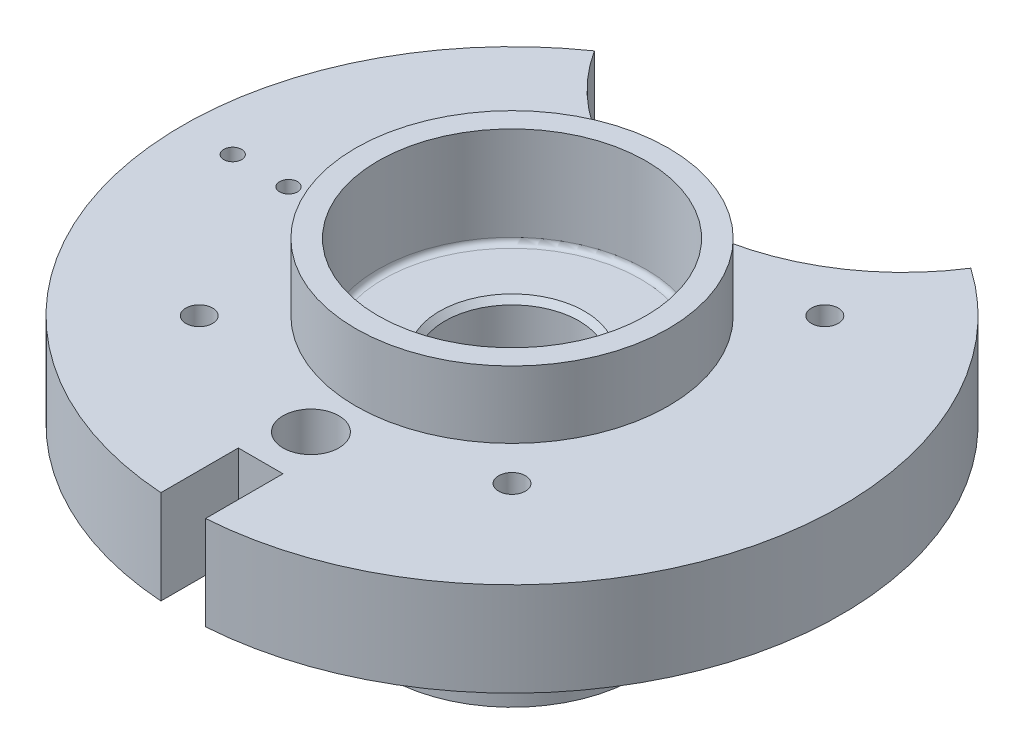
ISO-10303-21;
HEADER;
FILE_DESCRIPTION(('STEP AP214'),'2;1');
FILE_NAME('part.step','',(''),(''),'','','');
FILE_SCHEMA(('AUTOMOTIVE_DESIGN { 1 0 10303 214 1 1 1 1 }'));
ENDSEC;
DATA;
#1=APPLICATION_CONTEXT('core data for automotive mechanical design processes');
#2=APPLICATION_PROTOCOL_DEFINITION('international standard','automotive_design',2000,#1);
#3=PRODUCT_CONTEXT('',#1,'mechanical');
#4=PRODUCT('Part','Part','',(#3));
#5=PRODUCT_RELATED_PRODUCT_CATEGORY('part','',(#4));
#6=PRODUCT_DEFINITION_FORMATION('','',#4);
#7=PRODUCT_DEFINITION_CONTEXT('part definition',#1,'design');
#8=PRODUCT_DEFINITION('design','',#6,#7);
#9=PRODUCT_DEFINITION_SHAPE('','',#8);
#10=(LENGTH_UNIT() NAMED_UNIT(*) SI_UNIT(.MILLI.,.METRE.));
#11=(NAMED_UNIT(*) PLANE_ANGLE_UNIT() SI_UNIT($,.RADIAN.));
#12=(NAMED_UNIT(*) SI_UNIT($,.STERADIAN.) SOLID_ANGLE_UNIT());
#13=UNCERTAINTY_MEASURE_WITH_UNIT(LENGTH_MEASURE(1.E-05),#10,'distance_accuracy_value','');
#14=(GEOMETRIC_REPRESENTATION_CONTEXT(3) GLOBAL_UNCERTAINTY_ASSIGNED_CONTEXT((#13)) GLOBAL_UNIT_ASSIGNED_CONTEXT((#10,
#11,#12)) REPRESENTATION_CONTEXT('',''));
#15=CARTESIAN_POINT('',(0.,0.,0.));
#16=DIRECTION('',(0.,0.,1.));
#17=DIRECTION('',(1.,0.,0.));
#18=AXIS2_PLACEMENT_3D('',#15,#16,#17);
#19=CARTESIAN_POINT('',(0.,0.,0.));
#20=DIRECTION('',(0.,-1.,0.));
#21=DIRECTION('',(0.,0.,-1.));
#22=AXIS2_PLACEMENT_3D('',#19,#20,#21);
#23=CYLINDRICAL_SURFACE('',#22,59.);
#24=CARTESIAN_POINT('',(0.,28.,0.));
#25=DIRECTION('',(0.,-1.,0.));
#26=DIRECTION('',(0.,0.,-1.));
#27=AXIS2_PLACEMENT_3D('',#24,#25,#26);
#28=CIRCLE('',#27,59.);
#29=CARTESIAN_POINT('',(-4.,28.,58.8642506110458));
#30=VERTEX_POINT('',#29);
#31=CARTESIAN_POINT('',(-33.6894877021402,28.,-48.4357142857143));
#32=VERTEX_POINT('',#31);
#33=EDGE_CURVE('E118',#30,#32,#28,.T.);
#34=ORIENTED_EDGE('',*,*,#33,.F.);
#35=DIRECTION('',(0.,1.,0.));
#36=VECTOR('',#35,1.);
#37=CARTESIAN_POINT('',(-4.,-0.001000000000001,58.8642506110458));
#38=LINE('',#37,#36);
#39=CARTESIAN_POINT('',(-4.,44.8,58.8642506110458));
#40=VERTEX_POINT('',#39);
#41=EDGE_CURVE('E100',#30,#40,#38,.T.);
#42=ORIENTED_EDGE('',*,*,#41,.T.);
#43=CARTESIAN_POINT('',(0.,44.8,0.));
#44=DIRECTION('',(0.,-1.,0.));
#45=DIRECTION('',(0.,0.,-1.));
#46=AXIS2_PLACEMENT_3D('',#43,#44,#45);
#47=CIRCLE('',#46,59.);
#48=CARTESIAN_POINT('',(-33.6894877021402,44.8,-48.4357142857143));
#49=VERTEX_POINT('',#48);
#50=EDGE_CURVE('E61',#40,#49,#47,.T.);
#51=ORIENTED_EDGE('',*,*,#50,.T.);
#52=DIRECTION('',(0.,-1.,0.));
#53=VECTOR('',#52,1.);
#54=CARTESIAN_POINT('',(-33.6894877021402,36.4,-48.4357142857143));
#55=LINE('',#54,#53);
#56=EDGE_CURVE('E458',#32,#49,#55,.F.);
#57=ORIENTED_EDGE('',*,*,#56,.F.);
#58=EDGE_LOOP('',(#34,#42,#51,#57));
#59=FACE_BOUND('',#58,.T.);
#60=ADVANCED_FACE('F38',(#59),#23,.T.);
#61=CARTESIAN_POINT('',(0.,0.,0.));
#62=DIRECTION('',(0.,-1.,0.));
#63=DIRECTION('',(0.,0.,-1.));
#64=AXIS2_PLACEMENT_3D('',#61,#62,#63);
#65=CYLINDRICAL_SURFACE('',#64,28.);
#66=CARTESIAN_POINT('',(0.,44.8,0.));
#67=DIRECTION('',(0.,-1.,0.));
#68=DIRECTION('',(0.,0.,-1.));
#69=AXIS2_PLACEMENT_3D('',#66,#67,#68);
#70=CIRCLE('',#69,28.);
#71=CARTESIAN_POINT('',(0.,44.8,-28.));
#72=VERTEX_POINT('',#71);
#73=EDGE_CURVE('E464',#72,#72,#70,.T.);
#74=ORIENTED_EDGE('',*,*,#73,.F.);
#75=EDGE_LOOP('',(#74));
#76=FACE_BOUND('',#75,.T.);
#77=CARTESIAN_POINT('',(0.,56.8,0.));
#78=DIRECTION('',(0.,-1.,0.));
#79=DIRECTION('',(0.,0.,-1.));
#80=AXIS2_PLACEMENT_3D('',#77,#78,#79);
#81=CIRCLE('',#80,28.);
#82=CARTESIAN_POINT('',(0.,56.8,-28.));
#83=VERTEX_POINT('',#82);
#84=EDGE_CURVE('E145',#83,#83,#81,.T.);
#85=ORIENTED_EDGE('',*,*,#84,.T.);
#86=EDGE_LOOP('',(#85));
#87=FACE_BOUND('',#86,.T.);
#88=ADVANCED_FACE('F40',(#76,#87),#65,.T.);
#89=CARTESIAN_POINT('',(24.,56.8,0.));
#90=DIRECTION('',(0.,-1.,0.));
#91=DIRECTION('',(0.,0.,-1.));
#92=AXIS2_PLACEMENT_3D('',#89,#90,#91);
#93=PLANE('',#92);
#94=ORIENTED_EDGE('',*,*,#84,.F.);
#95=EDGE_LOOP('',(#94));
#96=FACE_BOUND('',#95,.T.);
#97=CARTESIAN_POINT('',(0.,56.8,0.));
#98=DIRECTION('',(0.,-1.,0.));
#99=DIRECTION('',(0.,0.,-1.));
#100=AXIS2_PLACEMENT_3D('',#97,#98,#99);
#101=CIRCLE('',#100,24.);
#102=CARTESIAN_POINT('',(0.,56.8,-24.));
#103=VERTEX_POINT('',#102);
#104=EDGE_CURVE('E141',#103,#103,#101,.T.);
#105=ORIENTED_EDGE('',*,*,#104,.T.);
#106=EDGE_LOOP('',(#105));
#107=FACE_BOUND('',#106,.T.);
#108=ADVANCED_FACE('F181',(#96,#107),#93,.F.);
#109=CARTESIAN_POINT('',(0.,0.,0.));
#110=DIRECTION('',(0.,-1.,0.));
#111=DIRECTION('',(0.,0.,-1.));
#112=AXIS2_PLACEMENT_3D('',#109,#110,#111);
#113=CYLINDRICAL_SURFACE('',#112,24.);
#114=CARTESIAN_POINT('',(0.,40.,0.));
#115=DIRECTION('',(0.,-1.,0.));
#116=DIRECTION('',(0.,0.,-1.));
#117=AXIS2_PLACEMENT_3D('',#114,#115,#116);
#118=CIRCLE('',#117,24.);
#119=CARTESIAN_POINT('',(0.,40.,-24.));
#120=VERTEX_POINT('',#119);
#121=EDGE_CURVE('E148',#120,#120,#118,.T.);
#122=ORIENTED_EDGE('',*,*,#121,.T.);
#123=EDGE_LOOP('',(#122));
#124=FACE_BOUND('',#123,.T.);
#125=ORIENTED_EDGE('',*,*,#104,.F.);
#126=EDGE_LOOP('',(#125));
#127=FACE_BOUND('',#126,.T.);
#128=ADVANCED_FACE('F222',(#124,#127),#113,.F.);
#129=CARTESIAN_POINT('',(12.,39.,0.));
#130=DIRECTION('',(0.,-1.,0.));
#131=DIRECTION('',(0.,0.,-1.));
#132=AXIS2_PLACEMENT_3D('',#129,#130,#131);
#133=PLANE('',#132);
#134=CARTESIAN_POINT('',(0.,39.,0.));
#135=DIRECTION('',(0.,-1.,0.));
#136=DIRECTION('',(0.,0.,-1.));
#137=AXIS2_PLACEMENT_3D('',#134,#135,#136);
#138=CIRCLE('',#137,13.);
#139=CARTESIAN_POINT('',(0.,39.,-13.));
#140=VERTEX_POINT('',#139);
#141=EDGE_CURVE('E46',#140,#140,#138,.T.);
#142=ORIENTED_EDGE('',*,*,#141,.T.);
#143=EDGE_LOOP('',(#142));
#144=FACE_BOUND('',#143,.T.);
#145=CARTESIAN_POINT('',(0.,39.,0.));
#146=DIRECTION('',(0.,-1.,0.));
#147=DIRECTION('',(0.,0.,-1.));
#148=AXIS2_PLACEMENT_3D('',#145,#146,#147);
#149=CIRCLE('',#148,23.);
#150=CARTESIAN_POINT('',(0.,39.,-23.));
#151=VERTEX_POINT('',#150);
#152=EDGE_CURVE('E151',#151,#151,#149,.F.);
#153=ORIENTED_EDGE('',*,*,#152,.T.);
#154=EDGE_LOOP('',(#153));
#155=FACE_BOUND('',#154,.T.);
#156=ADVANCED_FACE('F156',(#144,#155),#133,.F.);
#157=CARTESIAN_POINT('',(0.,0.,0.));
#158=DIRECTION('',(0.,-1.,0.));
#159=DIRECTION('',(0.,0.,-1.));
#160=AXIS2_PLACEMENT_3D('',#157,#158,#159);
#161=CYLINDRICAL_SURFACE('',#160,12.);
#162=CARTESIAN_POINT('',(0.,38.,0.));
#163=DIRECTION('',(0.,-1.,0.));
#164=DIRECTION('',(0.,0.,-1.));
#165=AXIS2_PLACEMENT_3D('',#162,#163,#164);
#166=CIRCLE('',#165,12.);
#167=CARTESIAN_POINT('',(0.,38.,-12.));
#168=VERTEX_POINT('',#167);
#169=EDGE_CURVE('E11',#168,#168,#166,.F.);
#170=ORIENTED_EDGE('',*,*,#169,.T.);
#171=EDGE_LOOP('',(#170));
#172=FACE_BOUND('',#171,.T.);
#173=CARTESIAN_POINT('',(0.,0.,0.));
#174=DIRECTION('',(0.,-1.,0.));
#175=DIRECTION('',(0.,0.,-1.));
#176=AXIS2_PLACEMENT_3D('',#173,#174,#175);
#177=CIRCLE('',#176,12.);
#178=CARTESIAN_POINT('',(0.,0.,-12.));
#179=VERTEX_POINT('',#178);
#180=EDGE_CURVE('E137',#179,#179,#177,.T.);
#181=ORIENTED_EDGE('',*,*,#180,.T.);
#182=EDGE_LOOP('',(#181));
#183=FACE_BOUND('',#182,.T.);
#184=ADVANCED_FACE('F215',(#172,#183),#161,.F.);
#185=CARTESIAN_POINT('',(22.5,0.,0.));
#186=DIRECTION('',(0.,1.,0.));
#187=DIRECTION('',(0.,0.,1.));
#188=AXIS2_PLACEMENT_3D('',#185,#186,#187);
#189=PLANE('',#188);
#190=ORIENTED_EDGE('',*,*,#180,.F.);
#191=EDGE_LOOP('',(#190));
#192=FACE_BOUND('',#191,.T.);
#193=CARTESIAN_POINT('',(0.,0.,0.));
#194=DIRECTION('',(0.,-1.,0.));
#195=DIRECTION('',(0.,0.,-1.));
#196=AXIS2_PLACEMENT_3D('',#193,#194,#195);
#197=CIRCLE('',#196,22.5);
#198=CARTESIAN_POINT('',(0.,0.,-22.5));
#199=VERTEX_POINT('',#198);
#200=EDGE_CURVE('E134',#199,#199,#197,.T.);
#201=ORIENTED_EDGE('',*,*,#200,.T.);
#202=EDGE_LOOP('',(#201));
#203=FACE_BOUND('',#202,.T.);
#204=ADVANCED_FACE('F211',(#192,#203),#189,.F.);
#205=CARTESIAN_POINT('',(0.,0.,0.));
#206=DIRECTION('',(0.,-1.,0.));
#207=DIRECTION('',(0.,0.,-1.));
#208=AXIS2_PLACEMENT_3D('',#205,#206,#207);
#209=CYLINDRICAL_SURFACE('',#208,22.5);
#210=ORIENTED_EDGE('',*,*,#200,.F.);
#211=EDGE_LOOP('',(#210));
#212=FACE_BOUND('',#211,.T.);
#213=CARTESIAN_POINT('',(0.,18.,0.));
#214=DIRECTION('',(0.,-1.,0.));
#215=DIRECTION('',(0.,0.,-1.));
#216=AXIS2_PLACEMENT_3D('',#213,#214,#215);
#217=CIRCLE('',#216,22.5);
#218=CARTESIAN_POINT('',(0.,18.,-22.5));
#219=VERTEX_POINT('',#218);
#220=EDGE_CURVE('E130',#219,#219,#217,.T.);
#221=ORIENTED_EDGE('',*,*,#220,.T.);
#222=EDGE_LOOP('',(#221));
#223=FACE_BOUND('',#222,.T.);
#224=ADVANCED_FACE('F207',(#212,#223),#209,.T.);
#225=CARTESIAN_POINT('',(29.,18.,0.));
#226=DIRECTION('',(0.,1.,0.));
#227=DIRECTION('',(0.,0.,1.));
#228=AXIS2_PLACEMENT_3D('',#225,#226,#227);
#229=PLANE('',#228);
#230=ORIENTED_EDGE('',*,*,#220,.F.);
#231=EDGE_LOOP('',(#230));
#232=FACE_BOUND('',#231,.T.);
#233=CARTESIAN_POINT('',(0.,18.,0.));
#234=DIRECTION('',(0.,-1.,0.));
#235=DIRECTION('',(0.,0.,-1.));
#236=AXIS2_PLACEMENT_3D('',#233,#234,#235);
#237=CIRCLE('',#236,29.);
#238=CARTESIAN_POINT('',(0.,18.,-29.));
#239=VERTEX_POINT('',#238);
#240=EDGE_CURVE('E123',#239,#239,#237,.T.);
#241=ORIENTED_EDGE('',*,*,#240,.T.);
#242=EDGE_LOOP('',(#241));
#243=FACE_BOUND('',#242,.T.);
#244=ADVANCED_FACE('F199',(#232,#243),#229,.F.);
#245=CARTESIAN_POINT('',(0.,0.,0.));
#246=DIRECTION('',(0.,-1.,0.));
#247=DIRECTION('',(0.,0.,-1.));
#248=AXIS2_PLACEMENT_3D('',#245,#246,#247);
#249=CYLINDRICAL_SURFACE('',#248,29.);
#250=ORIENTED_EDGE('',*,*,#240,.F.);
#251=EDGE_LOOP('',(#250));
#252=FACE_BOUND('',#251,.T.);
#253=CARTESIAN_POINT('',(0.,28.,0.));
#254=DIRECTION('',(0.,-1.,0.));
#255=DIRECTION('',(0.,0.,-1.));
#256=AXIS2_PLACEMENT_3D('',#253,#254,#255);
#257=CIRCLE('',#256,29.);
#258=CARTESIAN_POINT('',(0.,28.,-29.));
#259=VERTEX_POINT('',#258);
#260=EDGE_CURVE('E117',#259,#259,#257,.T.);
#261=ORIENTED_EDGE('',*,*,#260,.T.);
#262=EDGE_LOOP('',(#261));
#263=FACE_BOUND('',#262,.T.);
#264=ADVANCED_FACE('F194',(#252,#263),#249,.T.);
#265=CARTESIAN_POINT('',(59.,28.,0.));
#266=DIRECTION('',(0.,1.,0.));
#267=DIRECTION('',(0.,0.,1.));
#268=AXIS2_PLACEMENT_3D('',#265,#266,#267);
#269=PLANE('',#268);
#270=CARTESIAN_POINT('',(0.,28.,36.));
#271=DIRECTION('',(0.,1.,0.));
#272=DIRECTION('',(0.,0.,1.));
#273=AXIS2_PLACEMENT_3D('',#270,#271,#272);
#274=CIRCLE('',#273,5.);
#275=CARTESIAN_POINT('',(0.,28.,41.));
#276=VERTEX_POINT('',#275);
#277=EDGE_CURVE('E420',#276,#276,#274,.T.);
#278=ORIENTED_EDGE('',*,*,#277,.T.);
#279=EDGE_LOOP('',(#278));
#280=FACE_BOUND('',#279,.T.);
#281=CARTESIAN_POINT('',(-50.,28.,0.));
#282=DIRECTION('',(0.,1.,0.));
#283=DIRECTION('',(0.,0.,1.));
#284=AXIS2_PLACEMENT_3D('',#281,#282,#283);
#285=CIRCLE('',#284,1.6);
#286=CARTESIAN_POINT('',(-50.,28.,1.6));
#287=VERTEX_POINT('',#286);
#288=EDGE_CURVE('E425',#287,#287,#285,.F.);
#289=ORIENTED_EDGE('',*,*,#288,.F.);
#290=EDGE_LOOP('',(#289));
#291=FACE_BOUND('',#290,.T.);
#292=CARTESIAN_POINT('',(-40.,28.,0.));
#293=DIRECTION('',(0.,1.,0.));
#294=DIRECTION('',(0.,0.,1.));
#295=AXIS2_PLACEMENT_3D('',#292,#293,#294);
#296=CIRCLE('',#295,1.6);
#297=CARTESIAN_POINT('',(-40.,28.,1.6));
#298=VERTEX_POINT('',#297);
#299=EDGE_CURVE('E431',#298,#298,#296,.F.);
#300=ORIENTED_EDGE('',*,*,#299,.F.);
#301=EDGE_LOOP('',(#300));
#302=FACE_BOUND('',#301,.T.);
#303=CARTESIAN_POINT('',(26.,28.,26.));
#304=DIRECTION('',(0.,1.,0.));
#305=DIRECTION('',(0.,0.,1.));
#306=AXIS2_PLACEMENT_3D('',#303,#304,#305);
#307=CIRCLE('',#306,2.4);
#308=CARTESIAN_POINT('',(26.,28.,28.4));
#309=VERTEX_POINT('',#308);
#310=EDGE_CURVE('E437',#309,#309,#307,.F.);
#311=ORIENTED_EDGE('',*,*,#310,.F.);
#312=EDGE_LOOP('',(#311));
#313=FACE_BOUND('',#312,.T.);
#314=CARTESIAN_POINT('',(-28.,28.,28.));
#315=DIRECTION('',(0.,1.,0.));
#316=DIRECTION('',(0.,0.,1.));
#317=AXIS2_PLACEMENT_3D('',#314,#315,#316);
#318=CIRCLE('',#317,2.4);
#319=CARTESIAN_POINT('',(-28.,28.,30.4));
#320=VERTEX_POINT('',#319);
#321=EDGE_CURVE('E443',#320,#320,#318,.F.);
#322=ORIENTED_EDGE('',*,*,#321,.F.);
#323=EDGE_LOOP('',(#322));
#324=FACE_BOUND('',#323,.T.);
#325=CARTESIAN_POINT('',(28.,28.,-28.));
#326=DIRECTION('',(0.,1.,0.));
#327=DIRECTION('',(0.,0.,1.));
#328=AXIS2_PLACEMENT_3D('',#325,#326,#327);
#329=CIRCLE('',#328,2.4);
#330=CARTESIAN_POINT('',(28.,28.,-25.6));
#331=VERTEX_POINT('',#330);
#332=EDGE_CURVE('E449',#331,#331,#329,.F.);
#333=ORIENTED_EDGE('',*,*,#332,.F.);
#334=EDGE_LOOP('',(#333));
#335=FACE_BOUND('',#334,.T.);
#336=CARTESIAN_POINT('',(-26.,28.,-26.));
#337=DIRECTION('',(0.,1.,0.));
#338=DIRECTION('',(0.,0.,1.));
#339=AXIS2_PLACEMENT_3D('',#336,#337,#338);
#340=CIRCLE('',#339,2.4);
#341=CARTESIAN_POINT('',(-26.,28.,-23.6));
#342=VERTEX_POINT('',#341);
#343=EDGE_CURVE('E455',#342,#342,#340,.F.);
#344=ORIENTED_EDGE('',*,*,#343,.F.);
#345=EDGE_LOOP('',(#344));
#346=FACE_BOUND('',#345,.T.);
#347=ORIENTED_EDGE('',*,*,#260,.F.);
#348=EDGE_LOOP('',(#347));
#349=FACE_BOUND('',#348,.T.);
#350=DIRECTION('',(1.,0.,0.));
#351=VECTOR('',#350,1.);
#352=CARTESIAN_POINT('',(4.,28.,45.));
#353=LINE('',#352,#351);
#354=CARTESIAN_POINT('',(-4.,28.,45.));
#355=VERTEX_POINT('',#354);
#356=CARTESIAN_POINT('',(4.,28.,45.));
#357=VERTEX_POINT('',#356);
#358=EDGE_CURVE('E401',#355,#357,#353,.T.);
#359=ORIENTED_EDGE('',*,*,#358,.F.);
#360=DIRECTION('',(0.,0.,-1.));
#361=VECTOR('',#360,1.);
#362=CARTESIAN_POINT('',(-4.,28.,58.8642506110458));
#363=LINE('',#362,#361);
#364=EDGE_CURVE('E406',#30,#355,#363,.T.);
#365=ORIENTED_EDGE('',*,*,#364,.F.);
#366=ORIENTED_EDGE('',*,*,#33,.T.);
#367=CARTESIAN_POINT('',(0.,28.,-70.));
#368=DIRECTION('',(0.,1.,0.));
#369=DIRECTION('',(0.,0.,1.));
#370=AXIS2_PLACEMENT_3D('',#367,#368,#369);
#371=CIRCLE('',#370,40.);
#372=CARTESIAN_POINT('',(33.6894877021402,28.,-48.4357142857143));
#373=VERTEX_POINT('',#372);
#374=EDGE_CURVE('E115',#373,#32,#371,.F.);
#375=ORIENTED_EDGE('',*,*,#374,.F.);
#376=CARTESIAN_POINT('',(4.,28.,58.8642506110457));
#377=VERTEX_POINT('',#376);
#378=EDGE_CURVE('E107',#373,#377,#28,.T.);
#379=ORIENTED_EDGE('',*,*,#378,.T.);
#380=DIRECTION('',(0.,0.,1.));
#381=VECTOR('',#380,1.);
#382=CARTESIAN_POINT('',(4.,28.,58.8642506110458));
#383=LINE('',#382,#381);
#384=EDGE_CURVE('E92',#357,#377,#383,.T.);
#385=ORIENTED_EDGE('',*,*,#384,.F.);
#386=EDGE_LOOP('',(#359,#365,#366,#375,#379,#385));
#387=FACE_BOUND('',#386,.T.);
#388=ADVANCED_FACE('F113',(#280,#291,#302,#313,#324,#335,#346,#349,#387),#269,.F.);
#389=CARTESIAN_POINT('',(33.6894877021402,44.8,-48.4357142857143));
#390=VERTEX_POINT('',#389);
#391=CARTESIAN_POINT('',(4.,44.8,58.8642506110458));
#392=VERTEX_POINT('',#391);
#393=EDGE_CURVE('E109',#390,#392,#47,.T.);
#394=ORIENTED_EDGE('',*,*,#393,.T.);
#395=DIRECTION('',(0.,1.,0.));
#396=VECTOR('',#395,1.);
#397=CARTESIAN_POINT('',(4.,-0.001000000000001,58.8642506110458));
#398=LINE('',#397,#396);
#399=EDGE_CURVE('E53',#377,#392,#398,.T.);
#400=ORIENTED_EDGE('',*,*,#399,.F.);
#401=ORIENTED_EDGE('',*,*,#378,.F.);
#402=DIRECTION('',(0.,-1.,0.));
#403=VECTOR('',#402,1.);
#404=CARTESIAN_POINT('',(33.6894877021402,36.4,-48.4357142857143));
#405=LINE('',#404,#403);
#406=EDGE_CURVE('E460',#390,#373,#405,.T.);
#407=ORIENTED_EDGE('',*,*,#406,.F.);
#408=EDGE_LOOP('',(#394,#400,#401,#407));
#409=FACE_BOUND('',#408,.T.);
#410=ADVANCED_FACE('F105',(#409),#23,.T.);
#411=CARTESIAN_POINT('',(28.,44.8,0.));
#412=DIRECTION('',(0.,-1.,0.));
#413=DIRECTION('',(0.,0.,-1.));
#414=AXIS2_PLACEMENT_3D('',#411,#412,#413);
#415=PLANE('',#414);
#416=CARTESIAN_POINT('',(0.,44.8,36.));
#417=DIRECTION('',(0.,1.,0.));
#418=DIRECTION('',(0.,0.,1.));
#419=AXIS2_PLACEMENT_3D('',#416,#417,#418);
#420=CIRCLE('',#419,5.);
#421=CARTESIAN_POINT('',(0.,44.8,41.));
#422=VERTEX_POINT('',#421);
#423=EDGE_CURVE('E99',#422,#422,#420,.T.);
#424=ORIENTED_EDGE('',*,*,#423,.F.);
#425=EDGE_LOOP('',(#424));
#426=FACE_BOUND('',#425,.T.);
#427=CARTESIAN_POINT('',(-50.,44.8,0.));
#428=DIRECTION('',(0.,1.,0.));
#429=DIRECTION('',(0.,0.,1.));
#430=AXIS2_PLACEMENT_3D('',#427,#428,#429);
#431=CIRCLE('',#430,1.6);
#432=CARTESIAN_POINT('',(-50.,44.8,1.6));
#433=VERTEX_POINT('',#432);
#434=EDGE_CURVE('E422',#433,#433,#431,.T.);
#435=ORIENTED_EDGE('',*,*,#434,.F.);
#436=EDGE_LOOP('',(#435));
#437=FACE_BOUND('',#436,.T.);
#438=CARTESIAN_POINT('',(-40.,44.8,0.));
#439=DIRECTION('',(0.,1.,0.));
#440=DIRECTION('',(0.,0.,1.));
#441=AXIS2_PLACEMENT_3D('',#438,#439,#440);
#442=CIRCLE('',#441,1.6);
#443=CARTESIAN_POINT('',(-40.,44.8,1.6));
#444=VERTEX_POINT('',#443);
#445=EDGE_CURVE('E428',#444,#444,#442,.T.);
#446=ORIENTED_EDGE('',*,*,#445,.F.);
#447=EDGE_LOOP('',(#446));
#448=FACE_BOUND('',#447,.T.);
#449=CARTESIAN_POINT('',(26.,44.8,26.));
#450=DIRECTION('',(0.,1.,0.));
#451=DIRECTION('',(0.,0.,1.));
#452=AXIS2_PLACEMENT_3D('',#449,#450,#451);
#453=CIRCLE('',#452,2.4);
#454=CARTESIAN_POINT('',(26.,44.8,28.4));
#455=VERTEX_POINT('',#454);
#456=EDGE_CURVE('E434',#455,#455,#453,.T.);
#457=ORIENTED_EDGE('',*,*,#456,.F.);
#458=EDGE_LOOP('',(#457));
#459=FACE_BOUND('',#458,.T.);
#460=CARTESIAN_POINT('',(-28.,44.8,28.));
#461=DIRECTION('',(0.,1.,0.));
#462=DIRECTION('',(0.,0.,1.));
#463=AXIS2_PLACEMENT_3D('',#460,#461,#462);
#464=CIRCLE('',#463,2.4);
#465=CARTESIAN_POINT('',(-28.,44.8,30.4));
#466=VERTEX_POINT('',#465);
#467=EDGE_CURVE('E440',#466,#466,#464,.T.);
#468=ORIENTED_EDGE('',*,*,#467,.F.);
#469=EDGE_LOOP('',(#468));
#470=FACE_BOUND('',#469,.T.);
#471=CARTESIAN_POINT('',(28.,44.8,-28.));
#472=DIRECTION('',(0.,1.,0.));
#473=DIRECTION('',(0.,0.,1.));
#474=AXIS2_PLACEMENT_3D('',#471,#472,#473);
#475=CIRCLE('',#474,2.4);
#476=CARTESIAN_POINT('',(28.,44.8,-25.6));
#477=VERTEX_POINT('',#476);
#478=EDGE_CURVE('E446',#477,#477,#475,.T.);
#479=ORIENTED_EDGE('',*,*,#478,.F.);
#480=EDGE_LOOP('',(#479));
#481=FACE_BOUND('',#480,.T.);
#482=CARTESIAN_POINT('',(-26.,44.8,-26.));
#483=DIRECTION('',(0.,1.,0.));
#484=DIRECTION('',(0.,0.,1.));
#485=AXIS2_PLACEMENT_3D('',#482,#483,#484);
#486=CIRCLE('',#485,2.4);
#487=CARTESIAN_POINT('',(-26.,44.8,-23.6));
#488=VERTEX_POINT('',#487);
#489=EDGE_CURVE('E452',#488,#488,#486,.T.);
#490=ORIENTED_EDGE('',*,*,#489,.F.);
#491=EDGE_LOOP('',(#490));
#492=FACE_BOUND('',#491,.T.);
#493=ORIENTED_EDGE('',*,*,#50,.F.);
#494=DIRECTION('',(0.,0.,1.));
#495=VECTOR('',#494,1.);
#496=CARTESIAN_POINT('',(-4.,44.8,58.8642506110458));
#497=LINE('',#496,#495);
#498=CARTESIAN_POINT('',(-4.,44.8,45.));
#499=VERTEX_POINT('',#498);
#500=EDGE_CURVE('E110',#499,#40,#497,.T.);
#501=ORIENTED_EDGE('',*,*,#500,.F.);
#502=DIRECTION('',(-1.,0.,0.));
#503=VECTOR('',#502,1.);
#504=CARTESIAN_POINT('',(4.,44.8,45.));
#505=LINE('',#504,#503);
#506=CARTESIAN_POINT('',(4.,44.8,45.));
#507=VERTEX_POINT('',#506);
#508=EDGE_CURVE('E412',#507,#499,#505,.T.);
#509=ORIENTED_EDGE('',*,*,#508,.F.);
#510=DIRECTION('',(0.,0.,-1.));
#511=VECTOR('',#510,1.);
#512=CARTESIAN_POINT('',(4.,44.8,58.8642506110458));
#513=LINE('',#512,#511);
#514=EDGE_CURVE('E408',#392,#507,#513,.T.);
#515=ORIENTED_EDGE('',*,*,#514,.F.);
#516=ORIENTED_EDGE('',*,*,#393,.F.);
#517=CARTESIAN_POINT('',(0.,44.8,-70.));
#518=DIRECTION('',(0.,1.,0.));
#519=DIRECTION('',(0.,0.,1.));
#520=AXIS2_PLACEMENT_3D('',#517,#518,#519);
#521=CIRCLE('',#520,40.);
#522=EDGE_CURVE('E462',#49,#390,#521,.T.);
#523=ORIENTED_EDGE('',*,*,#522,.F.);
#524=EDGE_LOOP('',(#493,#501,#509,#515,#516,#523));
#525=FACE_BOUND('',#524,.T.);
#526=ORIENTED_EDGE('',*,*,#73,.T.);
#527=EDGE_LOOP('',(#526));
#528=FACE_BOUND('',#527,.T.);
#529=ADVANCED_FACE('F187',(#426,#437,#448,#459,#470,#481,#492,#525,#528),#415,.F.);
#530=CARTESIAN_POINT('',(0.,-0.001000000000001,-70.));
#531=DIRECTION('',(0.,1.,0.));
#532=DIRECTION('',(0.,0.,1.));
#533=AXIS2_PLACEMENT_3D('',#530,#531,#532);
#534=CYLINDRICAL_SURFACE('',#533,40.);
#535=ORIENTED_EDGE('',*,*,#406,.T.);
#536=ORIENTED_EDGE('',*,*,#374,.T.);
#537=ORIENTED_EDGE('',*,*,#56,.T.);
#538=ORIENTED_EDGE('',*,*,#522,.T.);
#539=EDGE_LOOP('',(#535,#536,#537,#538));
#540=FACE_BOUND('',#539,.T.);
#541=ADVANCED_FACE('F192',(#540),#534,.F.);
#542=CARTESIAN_POINT('',(-26.,-0.001000000000001,-26.));
#543=DIRECTION('',(0.,1.,0.));
#544=DIRECTION('',(0.,0.,1.));
#545=AXIS2_PLACEMENT_3D('',#542,#543,#544);
#546=CYLINDRICAL_SURFACE('',#545,2.4);
#547=ORIENTED_EDGE('',*,*,#489,.T.);
#548=EDGE_LOOP('',(#547));
#549=FACE_BOUND('',#548,.T.);
#550=ORIENTED_EDGE('',*,*,#343,.T.);
#551=EDGE_LOOP('',(#550));
#552=FACE_BOUND('',#551,.T.);
#553=ADVANCED_FACE('F281',(#549,#552),#546,.F.);
#554=CARTESIAN_POINT('',(28.,-0.001000000000001,-28.));
#555=DIRECTION('',(0.,1.,0.));
#556=DIRECTION('',(0.,0.,1.));
#557=AXIS2_PLACEMENT_3D('',#554,#555,#556);
#558=CYLINDRICAL_SURFACE('',#557,2.4);
#559=ORIENTED_EDGE('',*,*,#478,.T.);
#560=EDGE_LOOP('',(#559));
#561=FACE_BOUND('',#560,.T.);
#562=ORIENTED_EDGE('',*,*,#332,.T.);
#563=EDGE_LOOP('',(#562));
#564=FACE_BOUND('',#563,.T.);
#565=ADVANCED_FACE('F276',(#561,#564),#558,.F.);
#566=CARTESIAN_POINT('',(-28.,-0.001000000000001,28.));
#567=DIRECTION('',(0.,1.,0.));
#568=DIRECTION('',(0.,0.,1.));
#569=AXIS2_PLACEMENT_3D('',#566,#567,#568);
#570=CYLINDRICAL_SURFACE('',#569,2.4);
#571=ORIENTED_EDGE('',*,*,#467,.T.);
#572=EDGE_LOOP('',(#571));
#573=FACE_BOUND('',#572,.T.);
#574=ORIENTED_EDGE('',*,*,#321,.T.);
#575=EDGE_LOOP('',(#574));
#576=FACE_BOUND('',#575,.T.);
#577=ADVANCED_FACE('F280',(#573,#576),#570,.F.);
#578=CARTESIAN_POINT('',(26.,-0.001000000000001,26.));
#579=DIRECTION('',(0.,1.,0.));
#580=DIRECTION('',(0.,0.,1.));
#581=AXIS2_PLACEMENT_3D('',#578,#579,#580);
#582=CYLINDRICAL_SURFACE('',#581,2.4);
#583=ORIENTED_EDGE('',*,*,#456,.T.);
#584=EDGE_LOOP('',(#583));
#585=FACE_BOUND('',#584,.T.);
#586=ORIENTED_EDGE('',*,*,#310,.T.);
#587=EDGE_LOOP('',(#586));
#588=FACE_BOUND('',#587,.T.);
#589=ADVANCED_FACE('F295',(#585,#588),#582,.F.);
#590=CARTESIAN_POINT('',(-40.,-0.001000000000001,0.));
#591=DIRECTION('',(0.,1.,0.));
#592=DIRECTION('',(0.,0.,1.));
#593=AXIS2_PLACEMENT_3D('',#590,#591,#592);
#594=CYLINDRICAL_SURFACE('',#593,1.6);
#595=ORIENTED_EDGE('',*,*,#445,.T.);
#596=EDGE_LOOP('',(#595));
#597=FACE_BOUND('',#596,.T.);
#598=ORIENTED_EDGE('',*,*,#299,.T.);
#599=EDGE_LOOP('',(#598));
#600=FACE_BOUND('',#599,.T.);
#601=ADVANCED_FACE('F303',(#597,#600),#594,.F.);
#602=CARTESIAN_POINT('',(-50.,-0.001000000000001,0.));
#603=DIRECTION('',(0.,1.,0.));
#604=DIRECTION('',(0.,0.,1.));
#605=AXIS2_PLACEMENT_3D('',#602,#603,#604);
#606=CYLINDRICAL_SURFACE('',#605,1.6);
#607=ORIENTED_EDGE('',*,*,#434,.T.);
#608=EDGE_LOOP('',(#607));
#609=FACE_BOUND('',#608,.T.);
#610=ORIENTED_EDGE('',*,*,#288,.T.);
#611=EDGE_LOOP('',(#610));
#612=FACE_BOUND('',#611,.T.);
#613=ADVANCED_FACE('F172',(#609,#612),#606,.F.);
#614=CARTESIAN_POINT('',(0.,40.,0.));
#615=DIRECTION('',(0.,-1.,0.));
#616=DIRECTION('',(0.,0.,-1.));
#617=AXIS2_PLACEMENT_3D('',#614,#615,#616);
#618=TOROIDAL_SURFACE('',#617,23.,1.);
#619=ORIENTED_EDGE('',*,*,#152,.F.);
#620=EDGE_LOOP('',(#619));
#621=FACE_BOUND('',#620,.T.);
#622=ORIENTED_EDGE('',*,*,#121,.F.);
#623=EDGE_LOOP('',(#622));
#624=FACE_BOUND('',#623,.T.);
#625=ADVANCED_FACE('F162',(#621,#624),#618,.F.);
#626=CARTESIAN_POINT('',(0.,39.,0.));
#627=DIRECTION('',(0.,1.,0.));
#628=DIRECTION('',(0.,0.,1.));
#629=AXIS2_PLACEMENT_3D('',#626,#627,#628);
#630=CONICAL_SURFACE('',#629,13.,0.785398163397447);
#631=ORIENTED_EDGE('',*,*,#169,.F.);
#632=EDGE_LOOP('',(#631));
#633=FACE_BOUND('',#632,.T.);
#634=ORIENTED_EDGE('',*,*,#141,.F.);
#635=EDGE_LOOP('',(#634));
#636=FACE_BOUND('',#635,.T.);
#637=ADVANCED_FACE('F159',(#633,#636),#630,.F.);
#638=CARTESIAN_POINT('',(0.,0.,36.));
#639=DIRECTION('',(0.,1.,0.));
#640=DIRECTION('',(0.,0.,1.));
#641=AXIS2_PLACEMENT_3D('',#638,#639,#640);
#642=CYLINDRICAL_SURFACE('',#641,5.);
#643=ORIENTED_EDGE('',*,*,#423,.T.);
#644=EDGE_LOOP('',(#643));
#645=FACE_BOUND('',#644,.T.);
#646=ORIENTED_EDGE('',*,*,#277,.F.);
#647=EDGE_LOOP('',(#646));
#648=FACE_BOUND('',#647,.T.);
#649=ADVANCED_FACE('F161',(#645,#648),#642,.F.);
#650=CARTESIAN_POINT('',(-4.,-0.001000000000001,58.8642506110458));
#651=DIRECTION('',(-1.,0.,0.));
#652=DIRECTION('',(0.,0.,1.));
#653=AXIS2_PLACEMENT_3D('',#650,#651,#652);
#654=PLANE('',#653);
#655=ORIENTED_EDGE('',*,*,#364,.T.);
#656=DIRECTION('',(0.,1.,0.));
#657=VECTOR('',#656,1.);
#658=CARTESIAN_POINT('',(-4.,-0.001000000000001,45.));
#659=LINE('',#658,#657);
#660=EDGE_CURVE('E403',#355,#499,#659,.T.);
#661=ORIENTED_EDGE('',*,*,#660,.T.);
#662=ORIENTED_EDGE('',*,*,#500,.T.);
#663=ORIENTED_EDGE('',*,*,#41,.F.);
#664=EDGE_LOOP('',(#655,#661,#662,#663));
#665=FACE_BOUND('',#664,.T.);
#666=ADVANCED_FACE('F169',(#665),#654,.F.);
#667=CARTESIAN_POINT('',(4.,-0.001000000000001,45.));
#668=DIRECTION('',(0.,0.,-1.));
#669=DIRECTION('',(-1.,0.,0.));
#670=AXIS2_PLACEMENT_3D('',#667,#668,#669);
#671=PLANE('',#670);
#672=ORIENTED_EDGE('',*,*,#358,.T.);
#673=DIRECTION('',(0.,1.,0.));
#674=VECTOR('',#673,1.);
#675=CARTESIAN_POINT('',(4.,-0.001000000000001,45.));
#676=LINE('',#675,#674);
#677=EDGE_CURVE('E94',#357,#507,#676,.T.);
#678=ORIENTED_EDGE('',*,*,#677,.T.);
#679=ORIENTED_EDGE('',*,*,#508,.T.);
#680=ORIENTED_EDGE('',*,*,#660,.F.);
#681=EDGE_LOOP('',(#672,#678,#679,#680));
#682=FACE_BOUND('',#681,.T.);
#683=ADVANCED_FACE('F379',(#682),#671,.F.);
#684=CARTESIAN_POINT('',(4.,-0.001000000000001,58.8642506110458));
#685=DIRECTION('',(1.,0.,0.));
#686=DIRECTION('',(0.,0.,-1.));
#687=AXIS2_PLACEMENT_3D('',#684,#685,#686);
#688=PLANE('',#687);
#689=ORIENTED_EDGE('',*,*,#384,.T.);
#690=ORIENTED_EDGE('',*,*,#399,.T.);
#691=ORIENTED_EDGE('',*,*,#514,.T.);
#692=ORIENTED_EDGE('',*,*,#677,.F.);
#693=EDGE_LOOP('',(#689,#690,#691,#692));
#694=FACE_BOUND('',#693,.T.);
#695=ADVANCED_FACE('F93',(#694),#688,.F.);
#696=CLOSED_SHELL('',(#60,#88,#108,#128,#156,#184,#204,#224,#244,#264,#388,#410,#529,#541,#553,
#565,#577,#589,#601,#613,#625,#637,#649,#666,#683,#695));
#697=MANIFOLD_SOLID_BREP('B2',#696);
#698=ADVANCED_BREP_SHAPE_REPRESENTATION('',(#18,#697),#14);
#699=SHAPE_DEFINITION_REPRESENTATION(#9,#698);
ENDSEC;
END-ISO-10303-21;
